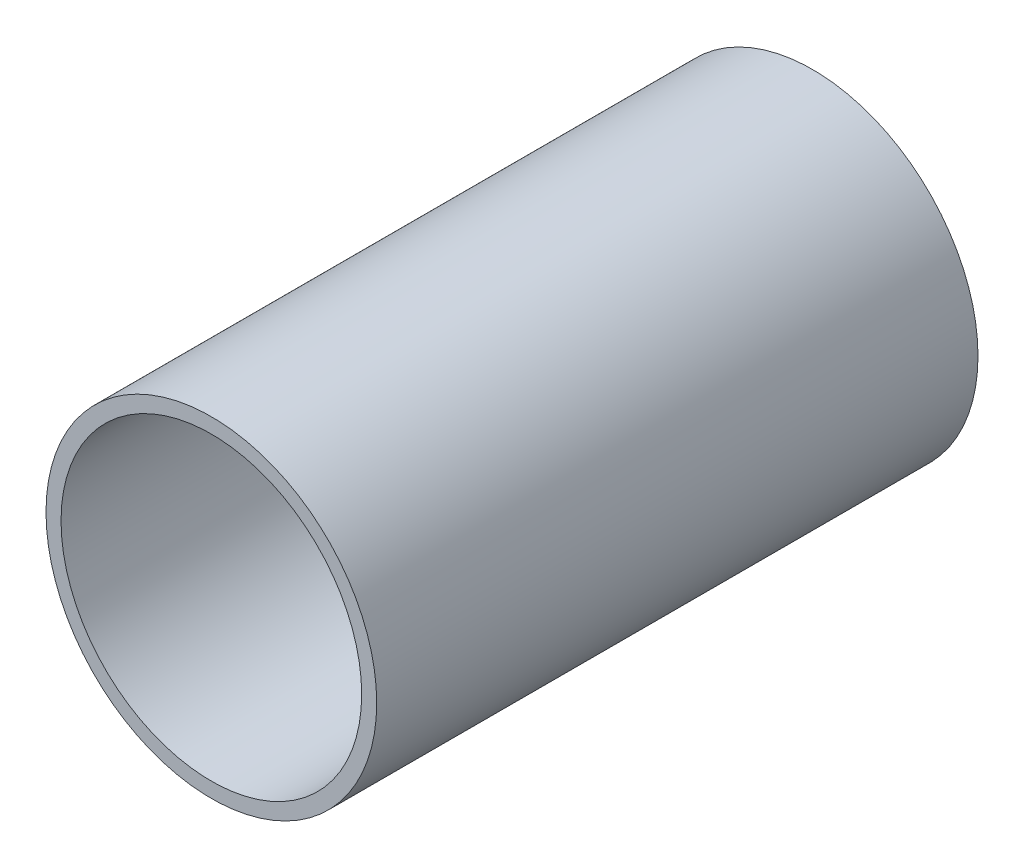
ISO-10303-21;
HEADER;
FILE_DESCRIPTION(('STEP AP214'),'2;1');
FILE_NAME('part.step','',(''),(''),'','','');
FILE_SCHEMA(('AUTOMOTIVE_DESIGN { 1 0 10303 214 1 1 1 1 }'));
ENDSEC;
DATA;
#1=APPLICATION_CONTEXT('core data for automotive mechanical design processes');
#2=APPLICATION_PROTOCOL_DEFINITION('international standard','automotive_design',2000,#1);
#3=PRODUCT_CONTEXT('',#1,'mechanical');
#4=PRODUCT('Part','Part','',(#3));
#5=PRODUCT_RELATED_PRODUCT_CATEGORY('part','',(#4));
#6=PRODUCT_DEFINITION_FORMATION('','',#4);
#7=PRODUCT_DEFINITION_CONTEXT('part definition',#1,'design');
#8=PRODUCT_DEFINITION('design','',#6,#7);
#9=PRODUCT_DEFINITION_SHAPE('','',#8);
#10=(LENGTH_UNIT() NAMED_UNIT(*) SI_UNIT(.MILLI.,.METRE.));
#11=(NAMED_UNIT(*) PLANE_ANGLE_UNIT() SI_UNIT($,.RADIAN.));
#12=(NAMED_UNIT(*) SI_UNIT($,.STERADIAN.) SOLID_ANGLE_UNIT());
#13=UNCERTAINTY_MEASURE_WITH_UNIT(LENGTH_MEASURE(1.E-05),#10,'distance_accuracy_value','');
#14=(GEOMETRIC_REPRESENTATION_CONTEXT(3) GLOBAL_UNCERTAINTY_ASSIGNED_CONTEXT((#13)) GLOBAL_UNIT_ASSIGNED_CONTEXT((#10,
#11,#12)) REPRESENTATION_CONTEXT('',''));
#15=CARTESIAN_POINT('',(0.,0.,0.));
#16=DIRECTION('',(0.,0.,1.));
#17=DIRECTION('',(1.,0.,0.));
#18=AXIS2_PLACEMENT_3D('',#15,#16,#17);
#19=CARTESIAN_POINT('',(0.,0.,762.));
#20=DIRECTION('',(0.,0.,1.));
#21=DIRECTION('',(1.,0.,0.));
#22=AXIS2_PLACEMENT_3D('',#19,#20,#21);
#23=PLANE('',#22);
#24=CARTESIAN_POINT('',(0.,0.,762.));
#25=DIRECTION('',(0.,0.,1.));
#26=DIRECTION('',(1.,0.,0.));
#27=AXIS2_PLACEMENT_3D('',#24,#25,#26);
#28=CIRCLE('',#27,419.1);
#29=CARTESIAN_POINT('',(419.1,0.,762.));
#30=VERTEX_POINT('',#29);
#31=EDGE_CURVE('E10',#30,#30,#28,.T.);
#32=ORIENTED_EDGE('',*,*,#31,.T.);
#33=EDGE_LOOP('',(#32));
#34=FACE_BOUND('',#33,.T.);
#35=CARTESIAN_POINT('',(0.,0.,762.));
#36=DIRECTION('',(0.,0.,1.));
#37=DIRECTION('',(1.,0.,0.));
#38=AXIS2_PLACEMENT_3D('',#35,#36,#37);
#39=CIRCLE('',#38,381.);
#40=CARTESIAN_POINT('',(381.,0.,762.));
#41=VERTEX_POINT('',#40);
#42=EDGE_CURVE('E48',#41,#41,#39,.T.);
#43=ORIENTED_EDGE('',*,*,#42,.F.);
#44=EDGE_LOOP('',(#43));
#45=FACE_BOUND('',#44,.T.);
#46=ADVANCED_FACE('F37',(#34,#45),#23,.T.);
#47=CARTESIAN_POINT('',(0.,0.,-762.));
#48=DIRECTION('',(0.,0.,1.));
#49=DIRECTION('',(1.,0.,0.));
#50=AXIS2_PLACEMENT_3D('',#47,#48,#49);
#51=PLANE('',#50);
#52=CARTESIAN_POINT('',(0.,0.,-762.));
#53=DIRECTION('',(0.,0.,1.));
#54=DIRECTION('',(1.,0.,0.));
#55=AXIS2_PLACEMENT_3D('',#52,#53,#54);
#56=CIRCLE('',#55,419.1);
#57=CARTESIAN_POINT('',(419.1,0.,-762.));
#58=VERTEX_POINT('',#57);
#59=EDGE_CURVE('E41',#58,#58,#56,.T.);
#60=ORIENTED_EDGE('',*,*,#59,.F.);
#61=EDGE_LOOP('',(#60));
#62=FACE_BOUND('',#61,.T.);
#63=CARTESIAN_POINT('',(0.,0.,-762.));
#64=DIRECTION('',(0.,0.,1.));
#65=DIRECTION('',(1.,0.,0.));
#66=AXIS2_PLACEMENT_3D('',#63,#64,#65);
#67=CIRCLE('',#66,381.);
#68=CARTESIAN_POINT('',(381.,0.,-762.));
#69=VERTEX_POINT('',#68);
#70=EDGE_CURVE('E50',#69,#69,#67,.T.);
#71=ORIENTED_EDGE('',*,*,#70,.T.);
#72=EDGE_LOOP('',(#71));
#73=FACE_BOUND('',#72,.T.);
#74=ADVANCED_FACE('F60',(#62,#73),#51,.F.);
#75=CARTESIAN_POINT('',(0.,0.,762.));
#76=DIRECTION('',(0.,0.,-1.));
#77=DIRECTION('',(-1.,0.,0.));
#78=AXIS2_PLACEMENT_3D('',#75,#76,#77);
#79=CYLINDRICAL_SURFACE('',#78,419.1);
#80=ORIENTED_EDGE('',*,*,#31,.F.);
#81=EDGE_LOOP('',(#80));
#82=FACE_BOUND('',#81,.T.);
#83=ORIENTED_EDGE('',*,*,#59,.T.);
#84=EDGE_LOOP('',(#83));
#85=FACE_BOUND('',#84,.T.);
#86=ADVANCED_FACE('F39',(#82,#85),#79,.T.);
#87=CARTESIAN_POINT('',(0.,0.,762.));
#88=DIRECTION('',(0.,0.,-1.));
#89=DIRECTION('',(-1.,0.,0.));
#90=AXIS2_PLACEMENT_3D('',#87,#88,#89);
#91=CYLINDRICAL_SURFACE('',#90,381.);
#92=ORIENTED_EDGE('',*,*,#42,.T.);
#93=EDGE_LOOP('',(#92));
#94=FACE_BOUND('',#93,.T.);
#95=ORIENTED_EDGE('',*,*,#70,.F.);
#96=EDGE_LOOP('',(#95));
#97=FACE_BOUND('',#96,.T.);
#98=ADVANCED_FACE('F56',(#94,#97),#91,.F.);
#99=CLOSED_SHELL('',(#46,#74,#86,#98));
#100=MANIFOLD_SOLID_BREP('B2',#99);
#101=ADVANCED_BREP_SHAPE_REPRESENTATION('',(#18,#100),#14);
#102=SHAPE_DEFINITION_REPRESENTATION(#9,#101);
ENDSEC;
END-ISO-10303-21;
